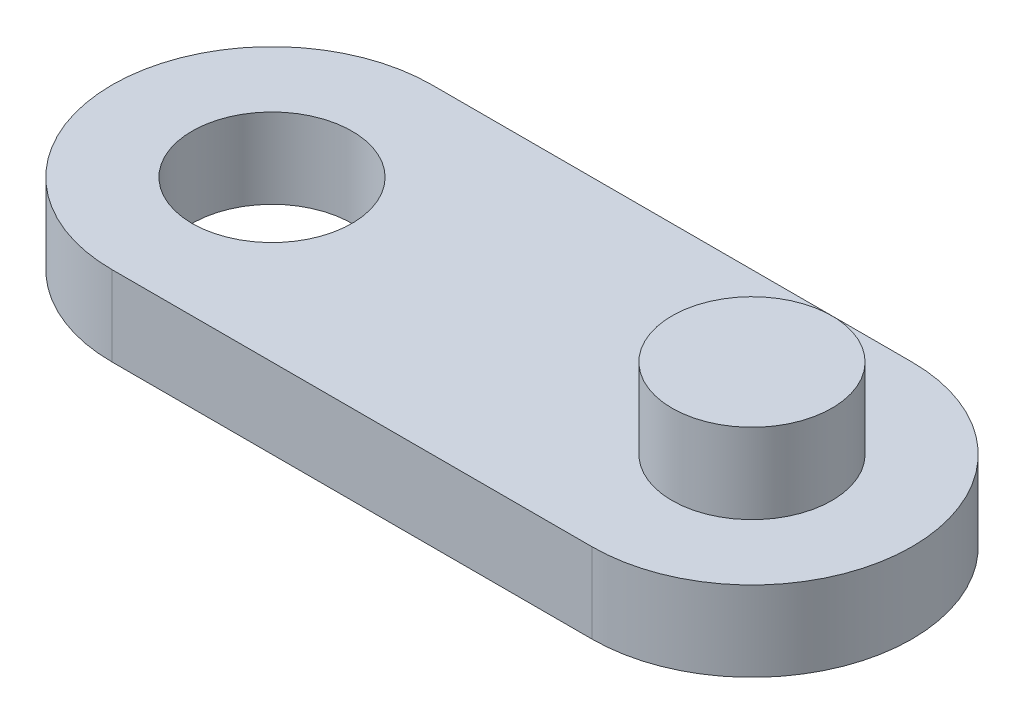
ISO-10303-21;
HEADER;
FILE_DESCRIPTION(('STEP AP214'),'2;1');
FILE_NAME('part.step','',(''),(''),'','','');
FILE_SCHEMA(('AUTOMOTIVE_DESIGN { 1 0 10303 214 1 1 1 1 }'));
ENDSEC;
DATA;
#1=APPLICATION_CONTEXT('core data for automotive mechanical design processes');
#2=APPLICATION_PROTOCOL_DEFINITION('international standard','automotive_design',2000,#1);
#3=PRODUCT_CONTEXT('',#1,'mechanical');
#4=PRODUCT('Part','Part','',(#3));
#5=PRODUCT_RELATED_PRODUCT_CATEGORY('part','',(#4));
#6=PRODUCT_DEFINITION_FORMATION('','',#4);
#7=PRODUCT_DEFINITION_CONTEXT('part definition',#1,'design');
#8=PRODUCT_DEFINITION('design','',#6,#7);
#9=PRODUCT_DEFINITION_SHAPE('','',#8);
#10=(LENGTH_UNIT() NAMED_UNIT(*) SI_UNIT(.MILLI.,.METRE.));
#11=(NAMED_UNIT(*) PLANE_ANGLE_UNIT() SI_UNIT($,.RADIAN.));
#12=(NAMED_UNIT(*) SI_UNIT($,.STERADIAN.) SOLID_ANGLE_UNIT());
#13=UNCERTAINTY_MEASURE_WITH_UNIT(LENGTH_MEASURE(1.E-05),#10,'distance_accuracy_value','');
#14=(GEOMETRIC_REPRESENTATION_CONTEXT(3) GLOBAL_UNCERTAINTY_ASSIGNED_CONTEXT((#13)) GLOBAL_UNIT_ASSIGNED_CONTEXT((#10,
#11,#12)) REPRESENTATION_CONTEXT('',''));
#15=CARTESIAN_POINT('',(0.,0.,0.));
#16=DIRECTION('',(0.,0.,1.));
#17=DIRECTION('',(1.,0.,0.));
#18=AXIS2_PLACEMENT_3D('',#15,#16,#17);
#19=CARTESIAN_POINT('',(-15.,5.,0.));
#20=DIRECTION('',(0.,-1.,0.));
#21=DIRECTION('',(0.,0.,-1.));
#22=AXIS2_PLACEMENT_3D('',#19,#20,#21);
#23=CYLINDRICAL_SURFACE('',#22,10.);
#24=CARTESIAN_POINT('',(-15.,0.,0.));
#25=DIRECTION('',(0.,1.,0.));
#26=DIRECTION('',(0.,0.,1.));
#27=AXIS2_PLACEMENT_3D('',#24,#25,#26);
#28=CIRCLE('',#27,10.);
#29=CARTESIAN_POINT('',(-15.,0.,-10.));
#30=VERTEX_POINT('',#29);
#31=CARTESIAN_POINT('',(-15.,0.,10.));
#32=VERTEX_POINT('',#31);
#33=EDGE_CURVE('E97',#30,#32,#28,.T.);
#34=ORIENTED_EDGE('',*,*,#33,.T.);
#35=DIRECTION('',(0.,-1.,0.));
#36=VECTOR('',#35,1.);
#37=CARTESIAN_POINT('',(-15.,5.,10.));
#38=LINE('',#37,#36);
#39=CARTESIAN_POINT('',(-15.,5.,10.));
#40=VERTEX_POINT('',#39);
#41=EDGE_CURVE('E11',#40,#32,#38,.T.);
#42=ORIENTED_EDGE('',*,*,#41,.F.);
#43=CARTESIAN_POINT('',(-15.,5.,0.));
#44=DIRECTION('',(0.,1.,0.));
#45=DIRECTION('',(0.,0.,1.));
#46=AXIS2_PLACEMENT_3D('',#43,#44,#45);
#47=CIRCLE('',#46,10.);
#48=CARTESIAN_POINT('',(-15.,5.,-10.));
#49=VERTEX_POINT('',#48);
#50=EDGE_CURVE('E85',#49,#40,#47,.T.);
#51=ORIENTED_EDGE('',*,*,#50,.F.);
#52=DIRECTION('',(0.,-1.,0.));
#53=VECTOR('',#52,1.);
#54=CARTESIAN_POINT('',(-15.,5.,-10.));
#55=LINE('',#54,#53);
#56=EDGE_CURVE('E93',#49,#30,#55,.T.);
#57=ORIENTED_EDGE('',*,*,#56,.T.);
#58=EDGE_LOOP('',(#34,#42,#51,#57));
#59=FACE_BOUND('',#58,.T.);
#60=ADVANCED_FACE('F34',(#59),#23,.T.);
#61=CARTESIAN_POINT('',(-15.,5.,10.));
#62=DIRECTION('',(0.,0.,-1.));
#63=DIRECTION('',(-1.,0.,0.));
#64=AXIS2_PLACEMENT_3D('',#61,#62,#63);
#65=PLANE('',#64);
#66=DIRECTION('',(1.,0.,0.));
#67=VECTOR('',#66,1.);
#68=CARTESIAN_POINT('',(-15.,0.,10.));
#69=LINE('',#68,#67);
#70=CARTESIAN_POINT('',(15.,0.,10.));
#71=VERTEX_POINT('',#70);
#72=EDGE_CURVE('E89',#32,#71,#69,.T.);
#73=ORIENTED_EDGE('',*,*,#72,.T.);
#74=DIRECTION('',(0.,-1.,0.));
#75=VECTOR('',#74,1.);
#76=CARTESIAN_POINT('',(15.,5.,10.));
#77=LINE('',#76,#75);
#78=CARTESIAN_POINT('',(15.,5.,10.));
#79=VERTEX_POINT('',#78);
#80=EDGE_CURVE('E42',#79,#71,#77,.T.);
#81=ORIENTED_EDGE('',*,*,#80,.F.);
#82=DIRECTION('',(1.,0.,0.));
#83=VECTOR('',#82,1.);
#84=CARTESIAN_POINT('',(-15.,5.,10.));
#85=LINE('',#84,#83);
#86=EDGE_CURVE('E80',#40,#79,#85,.T.);
#87=ORIENTED_EDGE('',*,*,#86,.F.);
#88=ORIENTED_EDGE('',*,*,#41,.T.);
#89=EDGE_LOOP('',(#73,#81,#87,#88));
#90=FACE_BOUND('',#89,.T.);
#91=ADVANCED_FACE('F88',(#90),#65,.F.);
#92=CARTESIAN_POINT('',(15.,5.,0.));
#93=DIRECTION('',(0.,-1.,0.));
#94=DIRECTION('',(0.,0.,-1.));
#95=AXIS2_PLACEMENT_3D('',#92,#93,#94);
#96=CYLINDRICAL_SURFACE('',#95,10.);
#97=CARTESIAN_POINT('',(15.,0.,0.));
#98=DIRECTION('',(0.,1.,0.));
#99=DIRECTION('',(0.,0.,1.));
#100=AXIS2_PLACEMENT_3D('',#97,#98,#99);
#101=CIRCLE('',#100,10.);
#102=CARTESIAN_POINT('',(15.,0.,-10.));
#103=VERTEX_POINT('',#102);
#104=EDGE_CURVE('E67',#71,#103,#101,.T.);
#105=ORIENTED_EDGE('',*,*,#104,.T.);
#106=DIRECTION('',(0.,-1.,0.));
#107=VECTOR('',#106,1.);
#108=CARTESIAN_POINT('',(15.,5.,-10.));
#109=LINE('',#108,#107);
#110=CARTESIAN_POINT('',(15.,5.,-10.));
#111=VERTEX_POINT('',#110);
#112=EDGE_CURVE('E90',#111,#103,#109,.T.);
#113=ORIENTED_EDGE('',*,*,#112,.F.);
#114=CARTESIAN_POINT('',(15.,5.,0.));
#115=DIRECTION('',(0.,1.,0.));
#116=DIRECTION('',(0.,0.,1.));
#117=AXIS2_PLACEMENT_3D('',#114,#115,#116);
#118=CIRCLE('',#117,10.);
#119=EDGE_CURVE('E83',#79,#111,#118,.T.);
#120=ORIENTED_EDGE('',*,*,#119,.F.);
#121=ORIENTED_EDGE('',*,*,#80,.T.);
#122=EDGE_LOOP('',(#105,#113,#120,#121));
#123=FACE_BOUND('',#122,.T.);
#124=ADVANCED_FACE('F91',(#123),#96,.T.);
#125=CARTESIAN_POINT('',(-15.,5.,-10.));
#126=DIRECTION('',(0.,0.,1.));
#127=DIRECTION('',(1.,0.,0.));
#128=AXIS2_PLACEMENT_3D('',#125,#126,#127);
#129=PLANE('',#128);
#130=DIRECTION('',(-1.,0.,0.));
#131=VECTOR('',#130,1.);
#132=CARTESIAN_POINT('',(-15.,0.,-10.));
#133=LINE('',#132,#131);
#134=EDGE_CURVE('E73',#103,#30,#133,.T.);
#135=ORIENTED_EDGE('',*,*,#134,.T.);
#136=ORIENTED_EDGE('',*,*,#56,.F.);
#137=DIRECTION('',(-1.,0.,0.));
#138=VECTOR('',#137,1.);
#139=CARTESIAN_POINT('',(-15.,5.,-10.));
#140=LINE('',#139,#138);
#141=EDGE_CURVE('E50',#111,#49,#140,.T.);
#142=ORIENTED_EDGE('',*,*,#141,.F.);
#143=ORIENTED_EDGE('',*,*,#112,.T.);
#144=EDGE_LOOP('',(#135,#136,#142,#143));
#145=FACE_BOUND('',#144,.T.);
#146=ADVANCED_FACE('F105',(#145),#129,.F.);
#147=CARTESIAN_POINT('',(-15.,5.,0.));
#148=DIRECTION('',(0.,1.,0.));
#149=DIRECTION('',(0.,0.,1.));
#150=AXIS2_PLACEMENT_3D('',#147,#148,#149);
#151=PLANE('',#150);
#152=CARTESIAN_POINT('',(-15.,5.,0.));
#153=DIRECTION('',(0.,1.,0.));
#154=DIRECTION('',(0.,0.,1.));
#155=AXIS2_PLACEMENT_3D('',#152,#153,#154);
#156=CIRCLE('',#155,5.);
#157=CARTESIAN_POINT('',(-15.,5.,5.));
#158=VERTEX_POINT('',#157);
#159=EDGE_CURVE('E117',#158,#158,#156,.T.);
#160=ORIENTED_EDGE('',*,*,#159,.F.);
#161=EDGE_LOOP('',(#160));
#162=FACE_BOUND('',#161,.T.);
#163=CARTESIAN_POINT('',(15.,5.,0.));
#164=DIRECTION('',(0.,1.,0.));
#165=DIRECTION('',(0.,0.,1.));
#166=AXIS2_PLACEMENT_3D('',#163,#164,#165);
#167=CIRCLE('',#166,5.);
#168=CARTESIAN_POINT('',(15.,5.,5.));
#169=VERTEX_POINT('',#168);
#170=EDGE_CURVE('E111',#169,#169,#167,.T.);
#171=ORIENTED_EDGE('',*,*,#170,.F.);
#172=EDGE_LOOP('',(#171));
#173=FACE_BOUND('',#172,.T.);
#174=ORIENTED_EDGE('',*,*,#50,.T.);
#175=ORIENTED_EDGE('',*,*,#86,.T.);
#176=ORIENTED_EDGE('',*,*,#119,.T.);
#177=ORIENTED_EDGE('',*,*,#141,.T.);
#178=EDGE_LOOP('',(#174,#175,#176,#177));
#179=FACE_BOUND('',#178,.T.);
#180=ADVANCED_FACE('F81',(#162,#173,#179),#151,.T.);
#181=CARTESIAN_POINT('',(-15.,0.,0.));
#182=DIRECTION('',(0.,1.,0.));
#183=DIRECTION('',(0.,0.,1.));
#184=AXIS2_PLACEMENT_3D('',#181,#182,#183);
#185=PLANE('',#184);
#186=CARTESIAN_POINT('',(-15.,0.,0.));
#187=DIRECTION('',(0.,1.,0.));
#188=DIRECTION('',(0.,0.,1.));
#189=AXIS2_PLACEMENT_3D('',#186,#187,#188);
#190=CIRCLE('',#189,5.);
#191=CARTESIAN_POINT('',(-15.,0.,5.));
#192=VERTEX_POINT('',#191);
#193=EDGE_CURVE('E114',#192,#192,#190,.T.);
#194=ORIENTED_EDGE('',*,*,#193,.T.);
#195=EDGE_LOOP('',(#194));
#196=FACE_BOUND('',#195,.T.);
#197=ORIENTED_EDGE('',*,*,#33,.F.);
#198=ORIENTED_EDGE('',*,*,#134,.F.);
#199=ORIENTED_EDGE('',*,*,#104,.F.);
#200=ORIENTED_EDGE('',*,*,#72,.F.);
#201=EDGE_LOOP('',(#197,#198,#199,#200));
#202=FACE_BOUND('',#201,.T.);
#203=ADVANCED_FACE('F108',(#196,#202),#185,.F.);
#204=CARTESIAN_POINT('',(15.,10.,0.));
#205=DIRECTION('',(0.,-1.,0.));
#206=DIRECTION('',(0.,0.,-1.));
#207=AXIS2_PLACEMENT_3D('',#204,#205,#206);
#208=CYLINDRICAL_SURFACE('',#207,5.);
#209=CARTESIAN_POINT('',(15.,10.,0.));
#210=DIRECTION('',(0.,1.,0.));
#211=DIRECTION('',(0.,0.,1.));
#212=AXIS2_PLACEMENT_3D('',#209,#210,#211);
#213=CIRCLE('',#212,5.);
#214=CARTESIAN_POINT('',(15.,10.,5.));
#215=VERTEX_POINT('',#214);
#216=EDGE_CURVE('E100',#215,#215,#213,.T.);
#217=ORIENTED_EDGE('',*,*,#216,.F.);
#218=EDGE_LOOP('',(#217));
#219=FACE_BOUND('',#218,.T.);
#220=ORIENTED_EDGE('',*,*,#170,.T.);
#221=EDGE_LOOP('',(#220));
#222=FACE_BOUND('',#221,.T.);
#223=ADVANCED_FACE('F136',(#219,#222),#208,.T.);
#224=CARTESIAN_POINT('',(15.,10.,0.));
#225=DIRECTION('',(0.,1.,0.));
#226=DIRECTION('',(0.,0.,1.));
#227=AXIS2_PLACEMENT_3D('',#224,#225,#226);
#228=PLANE('',#227);
#229=ORIENTED_EDGE('',*,*,#216,.T.);
#230=EDGE_LOOP('',(#229));
#231=FACE_BOUND('',#230,.T.);
#232=ADVANCED_FACE('F127',(#231),#228,.T.);
#233=CARTESIAN_POINT('',(-15.,0.,0.));
#234=DIRECTION('',(0.,1.,0.));
#235=DIRECTION('',(0.,0.,1.));
#236=AXIS2_PLACEMENT_3D('',#233,#234,#235);
#237=CYLINDRICAL_SURFACE('',#236,5.);
#238=ORIENTED_EDGE('',*,*,#193,.F.);
#239=EDGE_LOOP('',(#238));
#240=FACE_BOUND('',#239,.T.);
#241=ORIENTED_EDGE('',*,*,#159,.T.);
#242=EDGE_LOOP('',(#241));
#243=FACE_BOUND('',#242,.T.);
#244=ADVANCED_FACE('F124',(#240,#243),#237,.F.);
#245=CLOSED_SHELL('',(#60,#91,#124,#146,#180,#203,#223,#232,#244));
#246=MANIFOLD_SOLID_BREP('B2',#245);
#247=ADVANCED_BREP_SHAPE_REPRESENTATION('',(#18,#246),#14);
#248=SHAPE_DEFINITION_REPRESENTATION(#9,#247);
ENDSEC;
END-ISO-10303-21;
